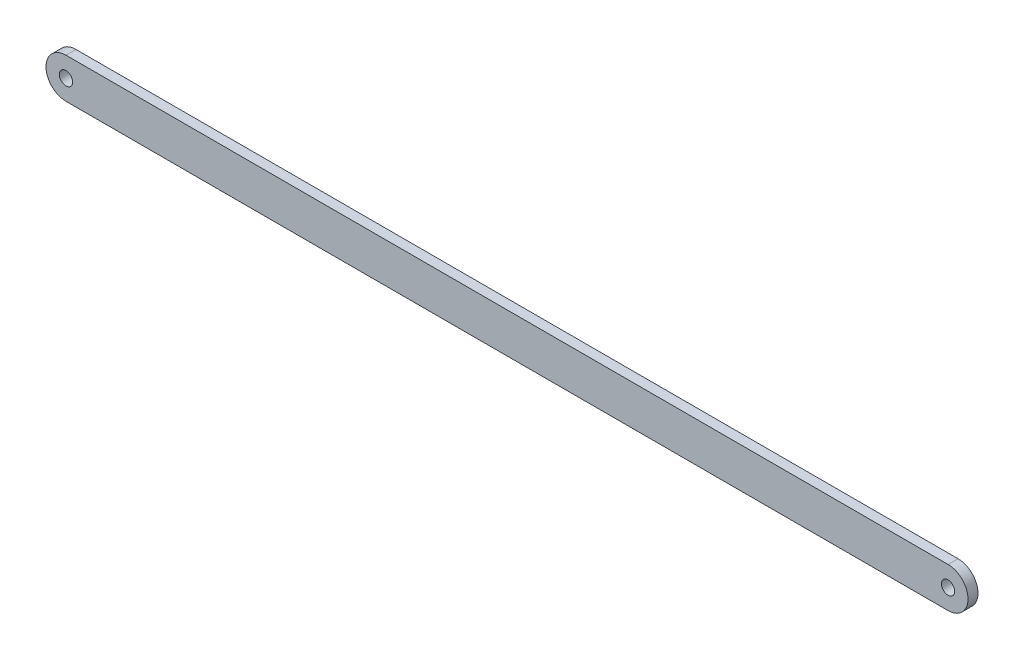
ISO-10303-21;
HEADER;
FILE_DESCRIPTION(('STEP AP214'),'2;1');
FILE_NAME('part.step','',(''),(''),'','','');
FILE_SCHEMA(('AUTOMOTIVE_DESIGN { 1 0 10303 214 1 1 1 1 }'));
ENDSEC;
DATA;
#1=APPLICATION_CONTEXT('core data for automotive mechanical design processes');
#2=APPLICATION_PROTOCOL_DEFINITION('international standard','automotive_design',2000,#1);
#3=PRODUCT_CONTEXT('',#1,'mechanical');
#4=PRODUCT('Part','Part','',(#3));
#5=PRODUCT_RELATED_PRODUCT_CATEGORY('part','',(#4));
#6=PRODUCT_DEFINITION_FORMATION('','',#4);
#7=PRODUCT_DEFINITION_CONTEXT('part definition',#1,'design');
#8=PRODUCT_DEFINITION('design','',#6,#7);
#9=PRODUCT_DEFINITION_SHAPE('','',#8);
#10=(LENGTH_UNIT() NAMED_UNIT(*) SI_UNIT(.MILLI.,.METRE.));
#11=(NAMED_UNIT(*) PLANE_ANGLE_UNIT() SI_UNIT($,.RADIAN.));
#12=(NAMED_UNIT(*) SI_UNIT($,.STERADIAN.) SOLID_ANGLE_UNIT());
#13=UNCERTAINTY_MEASURE_WITH_UNIT(LENGTH_MEASURE(1.E-05),#10,'distance_accuracy_value','');
#14=(GEOMETRIC_REPRESENTATION_CONTEXT(3) GLOBAL_UNCERTAINTY_ASSIGNED_CONTEXT((#13)) GLOBAL_UNIT_ASSIGNED_CONTEXT((#10,
#11,#12)) REPRESENTATION_CONTEXT('',''));
#15=CARTESIAN_POINT('',(0.,0.,0.));
#16=DIRECTION('',(0.,0.,1.));
#17=DIRECTION('',(1.,0.,0.));
#18=AXIS2_PLACEMENT_3D('',#15,#16,#17);
#19=CARTESIAN_POINT('',(-35.3127241673783,0.,3.));
#20=DIRECTION('',(0.,0.,1.));
#21=DIRECTION('',(1.,0.,0.));
#22=AXIS2_PLACEMENT_3D('',#19,#20,#21);
#23=PLANE('',#22);
#24=CARTESIAN_POINT('',(-35.3127241673783,0.,3.));
#25=DIRECTION('',(0.,0.,1.));
#26=DIRECTION('',(1.,0.,0.));
#27=AXIS2_PLACEMENT_3D('',#24,#25,#26);
#28=CIRCLE('',#27,2.);
#29=CARTESIAN_POINT('',(-33.3127241673783,0.,3.));
#30=VERTEX_POINT('',#29);
#31=EDGE_CURVE('E100',#30,#30,#28,.T.);
#32=ORIENTED_EDGE('',*,*,#31,.F.);
#33=EDGE_LOOP('',(#32));
#34=FACE_BOUND('',#33,.T.);
#35=CARTESIAN_POINT('',(-35.3127241673783,0.,3.));
#36=DIRECTION('',(0.,0.,1.));
#37=DIRECTION('',(1.,0.,0.));
#38=AXIS2_PLACEMENT_3D('',#35,#36,#37);
#39=CIRCLE('',#38,6.);
#40=CARTESIAN_POINT('',(-35.3127241673783,6.,3.));
#41=VERTEX_POINT('',#40);
#42=CARTESIAN_POINT('',(-35.3127241673783,-6.,3.));
#43=VERTEX_POINT('',#42);
#44=EDGE_CURVE('E85',#41,#43,#39,.T.);
#45=ORIENTED_EDGE('',*,*,#44,.T.);
#46=DIRECTION('',(1.,0.,0.));
#47=VECTOR('',#46,1.);
#48=CARTESIAN_POINT('',(-35.3127241673783,-6.,3.));
#49=LINE('',#48,#47);
#50=CARTESIAN_POINT('',(229.687275832622,-6.,3.));
#51=VERTEX_POINT('',#50);
#52=EDGE_CURVE('E80',#43,#51,#49,.T.);
#53=ORIENTED_EDGE('',*,*,#52,.T.);
#54=CARTESIAN_POINT('',(229.687275832622,0.,3.));
#55=DIRECTION('',(0.,0.,1.));
#56=DIRECTION('',(1.,0.,0.));
#57=AXIS2_PLACEMENT_3D('',#54,#55,#56);
#58=CIRCLE('',#57,6.);
#59=CARTESIAN_POINT('',(229.687275832622,6.,3.));
#60=VERTEX_POINT('',#59);
#61=EDGE_CURVE('E83',#51,#60,#58,.T.);
#62=ORIENTED_EDGE('',*,*,#61,.T.);
#63=DIRECTION('',(-1.,0.,0.));
#64=VECTOR('',#63,1.);
#65=CARTESIAN_POINT('',(-35.3127241673783,6.,3.));
#66=LINE('',#65,#64);
#67=EDGE_CURVE('E50',#60,#41,#66,.T.);
#68=ORIENTED_EDGE('',*,*,#67,.T.);
#69=EDGE_LOOP('',(#45,#53,#62,#68));
#70=FACE_BOUND('',#69,.T.);
#71=CARTESIAN_POINT('',(229.687275832622,0.,3.));
#72=DIRECTION('',(0.,0.,1.));
#73=DIRECTION('',(1.,0.,0.));
#74=AXIS2_PLACEMENT_3D('',#71,#72,#73);
#75=CIRCLE('',#74,2.);
#76=CARTESIAN_POINT('',(231.687275832622,0.,3.));
#77=VERTEX_POINT('',#76);
#78=EDGE_CURVE('E115',#77,#77,#75,.T.);
#79=ORIENTED_EDGE('',*,*,#78,.F.);
#80=EDGE_LOOP('',(#79));
#81=FACE_BOUND('',#80,.T.);
#82=ADVANCED_FACE('F33',(#34,#70,#81),#23,.T.);
#83=CARTESIAN_POINT('',(-35.3127241673783,0.,0.));
#84=DIRECTION('',(0.,0.,1.));
#85=DIRECTION('',(1.,0.,0.));
#86=AXIS2_PLACEMENT_3D('',#83,#84,#85);
#87=PLANE('',#86);
#88=CARTESIAN_POINT('',(-35.3127241673783,0.,0.));
#89=DIRECTION('',(0.,0.,1.));
#90=DIRECTION('',(1.,0.,0.));
#91=AXIS2_PLACEMENT_3D('',#88,#89,#90);
#92=CIRCLE('',#91,2.);
#93=CARTESIAN_POINT('',(-33.3127241673783,0.,0.));
#94=VERTEX_POINT('',#93);
#95=EDGE_CURVE('E112',#94,#94,#92,.T.);
#96=ORIENTED_EDGE('',*,*,#95,.T.);
#97=EDGE_LOOP('',(#96));
#98=FACE_BOUND('',#97,.T.);
#99=CARTESIAN_POINT('',(-35.3127241673783,0.,0.));
#100=DIRECTION('',(0.,0.,1.));
#101=DIRECTION('',(1.,0.,0.));
#102=AXIS2_PLACEMENT_3D('',#99,#100,#101);
#103=CIRCLE('',#102,6.);
#104=CARTESIAN_POINT('',(-35.3127241673783,6.,0.));
#105=VERTEX_POINT('',#104);
#106=CARTESIAN_POINT('',(-35.3127241673783,-6.,0.));
#107=VERTEX_POINT('',#106);
#108=EDGE_CURVE('E97',#105,#107,#103,.T.);
#109=ORIENTED_EDGE('',*,*,#108,.F.);
#110=DIRECTION('',(-1.,0.,0.));
#111=VECTOR('',#110,1.);
#112=CARTESIAN_POINT('',(-35.3127241673783,6.,0.));
#113=LINE('',#112,#111);
#114=CARTESIAN_POINT('',(229.687275832622,6.,0.));
#115=VERTEX_POINT('',#114);
#116=EDGE_CURVE('E73',#115,#105,#113,.T.);
#117=ORIENTED_EDGE('',*,*,#116,.F.);
#118=CARTESIAN_POINT('',(229.687275832622,0.,0.));
#119=DIRECTION('',(0.,0.,1.));
#120=DIRECTION('',(1.,0.,0.));
#121=AXIS2_PLACEMENT_3D('',#118,#119,#120);
#122=CIRCLE('',#121,6.);
#123=CARTESIAN_POINT('',(229.687275832622,-6.,0.));
#124=VERTEX_POINT('',#123);
#125=EDGE_CURVE('E67',#124,#115,#122,.T.);
#126=ORIENTED_EDGE('',*,*,#125,.F.);
#127=DIRECTION('',(1.,0.,0.));
#128=VECTOR('',#127,1.);
#129=CARTESIAN_POINT('',(-35.3127241673783,-6.,0.));
#130=LINE('',#129,#128);
#131=EDGE_CURVE('E89',#107,#124,#130,.T.);
#132=ORIENTED_EDGE('',*,*,#131,.F.);
#133=EDGE_LOOP('',(#109,#117,#126,#132));
#134=FACE_BOUND('',#133,.T.);
#135=CARTESIAN_POINT('',(229.687275832622,0.,0.));
#136=DIRECTION('',(0.,0.,1.));
#137=DIRECTION('',(1.,0.,0.));
#138=AXIS2_PLACEMENT_3D('',#135,#136,#137);
#139=CIRCLE('',#138,2.);
#140=CARTESIAN_POINT('',(231.687275832622,0.,0.));
#141=VERTEX_POINT('',#140);
#142=EDGE_CURVE('E118',#141,#141,#139,.T.);
#143=ORIENTED_EDGE('',*,*,#142,.T.);
#144=EDGE_LOOP('',(#143));
#145=FACE_BOUND('',#144,.T.);
#146=ADVANCED_FACE('F108',(#98,#134,#145),#87,.F.);
#147=CARTESIAN_POINT('',(-35.3127241673783,0.,3.));
#148=DIRECTION('',(0.,0.,-1.));
#149=DIRECTION('',(-1.,0.,0.));
#150=AXIS2_PLACEMENT_3D('',#147,#148,#149);
#151=CYLINDRICAL_SURFACE('',#150,6.);
#152=ORIENTED_EDGE('',*,*,#108,.T.);
#153=DIRECTION('',(0.,0.,-1.));
#154=VECTOR('',#153,1.);
#155=CARTESIAN_POINT('',(-35.3127241673783,-6.,3.));
#156=LINE('',#155,#154);
#157=EDGE_CURVE('E11',#43,#107,#156,.T.);
#158=ORIENTED_EDGE('',*,*,#157,.F.);
#159=ORIENTED_EDGE('',*,*,#44,.F.);
#160=DIRECTION('',(0.,0.,-1.));
#161=VECTOR('',#160,1.);
#162=CARTESIAN_POINT('',(-35.3127241673783,6.,3.));
#163=LINE('',#162,#161);
#164=EDGE_CURVE('E93',#41,#105,#163,.T.);
#165=ORIENTED_EDGE('',*,*,#164,.T.);
#166=EDGE_LOOP('',(#152,#158,#159,#165));
#167=FACE_BOUND('',#166,.T.);
#168=ADVANCED_FACE('F35',(#167),#151,.T.);
#169=CARTESIAN_POINT('',(-35.3127241673783,-6.,3.));
#170=DIRECTION('',(0.,1.,0.));
#171=DIRECTION('',(0.,0.,1.));
#172=AXIS2_PLACEMENT_3D('',#169,#170,#171);
#173=PLANE('',#172);
#174=ORIENTED_EDGE('',*,*,#131,.T.);
#175=DIRECTION('',(0.,0.,-1.));
#176=VECTOR('',#175,1.);
#177=CARTESIAN_POINT('',(229.687275832622,-6.,3.));
#178=LINE('',#177,#176);
#179=EDGE_CURVE('E42',#51,#124,#178,.T.);
#180=ORIENTED_EDGE('',*,*,#179,.F.);
#181=ORIENTED_EDGE('',*,*,#52,.F.);
#182=ORIENTED_EDGE('',*,*,#157,.T.);
#183=EDGE_LOOP('',(#174,#180,#181,#182));
#184=FACE_BOUND('',#183,.T.);
#185=ADVANCED_FACE('F88',(#184),#173,.F.);
#186=CARTESIAN_POINT('',(229.687275832622,0.,3.));
#187=DIRECTION('',(0.,0.,-1.));
#188=DIRECTION('',(-1.,0.,0.));
#189=AXIS2_PLACEMENT_3D('',#186,#187,#188);
#190=CYLINDRICAL_SURFACE('',#189,6.);
#191=ORIENTED_EDGE('',*,*,#125,.T.);
#192=DIRECTION('',(0.,0.,-1.));
#193=VECTOR('',#192,1.);
#194=CARTESIAN_POINT('',(229.687275832622,6.,3.));
#195=LINE('',#194,#193);
#196=EDGE_CURVE('E90',#60,#115,#195,.T.);
#197=ORIENTED_EDGE('',*,*,#196,.F.);
#198=ORIENTED_EDGE('',*,*,#61,.F.);
#199=ORIENTED_EDGE('',*,*,#179,.T.);
#200=EDGE_LOOP('',(#191,#197,#198,#199));
#201=FACE_BOUND('',#200,.T.);
#202=ADVANCED_FACE('F91',(#201),#190,.T.);
#203=CARTESIAN_POINT('',(-35.3127241673783,6.,3.));
#204=DIRECTION('',(0.,-1.,0.));
#205=DIRECTION('',(0.,0.,-1.));
#206=AXIS2_PLACEMENT_3D('',#203,#204,#205);
#207=PLANE('',#206);
#208=ORIENTED_EDGE('',*,*,#116,.T.);
#209=ORIENTED_EDGE('',*,*,#164,.F.);
#210=ORIENTED_EDGE('',*,*,#67,.F.);
#211=ORIENTED_EDGE('',*,*,#196,.T.);
#212=EDGE_LOOP('',(#208,#209,#210,#211));
#213=FACE_BOUND('',#212,.T.);
#214=ADVANCED_FACE('F105',(#213),#207,.F.);
#215=CARTESIAN_POINT('',(-35.3127241673783,0.,3.));
#216=DIRECTION('',(0.,0.,-1.));
#217=DIRECTION('',(-1.,0.,0.));
#218=AXIS2_PLACEMENT_3D('',#215,#216,#217);
#219=CYLINDRICAL_SURFACE('',#218,2.);
#220=ORIENTED_EDGE('',*,*,#31,.T.);
#221=EDGE_LOOP('',(#220));
#222=FACE_BOUND('',#221,.T.);
#223=ORIENTED_EDGE('',*,*,#95,.F.);
#224=EDGE_LOOP('',(#223));
#225=FACE_BOUND('',#224,.T.);
#226=ADVANCED_FACE('F136',(#222,#225),#219,.F.);
#227=CARTESIAN_POINT('',(229.687275832622,0.,3.));
#228=DIRECTION('',(0.,0.,-1.));
#229=DIRECTION('',(-1.,0.,0.));
#230=AXIS2_PLACEMENT_3D('',#227,#228,#229);
#231=CYLINDRICAL_SURFACE('',#230,2.);
#232=ORIENTED_EDGE('',*,*,#78,.T.);
#233=EDGE_LOOP('',(#232));
#234=FACE_BOUND('',#233,.T.);
#235=ORIENTED_EDGE('',*,*,#142,.F.);
#236=EDGE_LOOP('',(#235));
#237=FACE_BOUND('',#236,.T.);
#238=ADVANCED_FACE('F124',(#234,#237),#231,.F.);
#239=CLOSED_SHELL('',(#82,#146,#168,#185,#202,#214,#226,#238));
#240=MANIFOLD_SOLID_BREP('B2',#239);
#241=ADVANCED_BREP_SHAPE_REPRESENTATION('',(#18,#240),#14);
#242=SHAPE_DEFINITION_REPRESENTATION(#9,#241);
ENDSEC;
END-ISO-10303-21;
